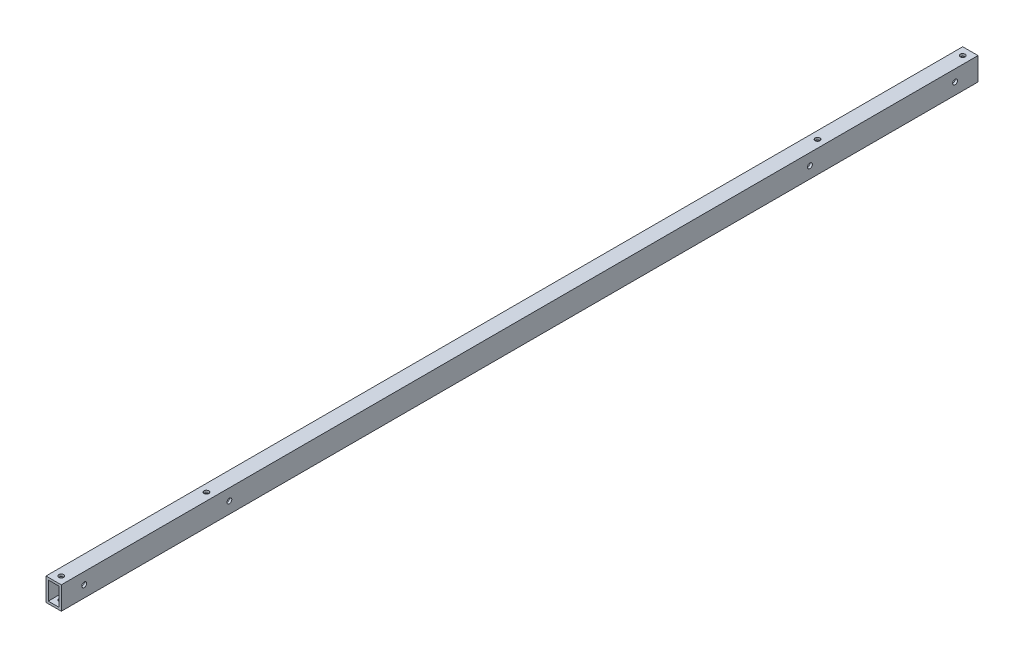
ISO-10303-21;
HEADER;
FILE_DESCRIPTION(('STEP AP214'),'2;1');
FILE_NAME('part.step','',(''),(''),'','','');
FILE_SCHEMA(('AUTOMOTIVE_DESIGN { 1 0 10303 214 1 1 1 1 }'));
ENDSEC;
DATA;
#1=APPLICATION_CONTEXT('core data for automotive mechanical design processes');
#2=APPLICATION_PROTOCOL_DEFINITION('international standard','automotive_design',2000,#1);
#3=PRODUCT_CONTEXT('',#1,'mechanical');
#4=PRODUCT('Part','Part','',(#3));
#5=PRODUCT_RELATED_PRODUCT_CATEGORY('part','',(#4));
#6=PRODUCT_DEFINITION_FORMATION('','',#4);
#7=PRODUCT_DEFINITION_CONTEXT('part definition',#1,'design');
#8=PRODUCT_DEFINITION('design','',#6,#7);
#9=PRODUCT_DEFINITION_SHAPE('','',#8);
#10=(LENGTH_UNIT() NAMED_UNIT(*) SI_UNIT(.MILLI.,.METRE.));
#11=(NAMED_UNIT(*) PLANE_ANGLE_UNIT() SI_UNIT($,.RADIAN.));
#12=(NAMED_UNIT(*) SI_UNIT($,.STERADIAN.) SOLID_ANGLE_UNIT());
#13=UNCERTAINTY_MEASURE_WITH_UNIT(LENGTH_MEASURE(1.E-05),#10,'distance_accuracy_value','');
#14=(GEOMETRIC_REPRESENTATION_CONTEXT(3) GLOBAL_UNCERTAINTY_ASSIGNED_CONTEXT((#13)) GLOBAL_UNIT_ASSIGNED_CONTEXT((#10,
#11,#12)) REPRESENTATION_CONTEXT('',''));
#15=CARTESIAN_POINT('',(0.,0.,0.));
#16=DIRECTION('',(0.,0.,1.));
#17=DIRECTION('',(1.,0.,0.));
#18=AXIS2_PLACEMENT_3D('',#15,#16,#17);
#19=CARTESIAN_POINT('',(0.,0.,600.));
#20=DIRECTION('',(0.,0.,1.));
#21=DIRECTION('',(1.,0.,0.));
#22=AXIS2_PLACEMENT_3D('',#19,#20,#21);
#23=PLANE('',#22);
#24=DIRECTION('',(0.,1.,0.));
#25=VECTOR('',#24,1.);
#26=CARTESIAN_POINT('',(5.,-7.5,600.));
#27=LINE('',#26,#25);
#28=CARTESIAN_POINT('',(5.,-7.5,600.));
#29=VERTEX_POINT('',#28);
#30=CARTESIAN_POINT('',(5.,7.5,600.));
#31=VERTEX_POINT('',#30);
#32=EDGE_CURVE('E162',#29,#31,#27,.T.);
#33=ORIENTED_EDGE('',*,*,#32,.T.);
#34=DIRECTION('',(-1.,0.,0.));
#35=VECTOR('',#34,1.);
#36=CARTESIAN_POINT('',(-5.,7.5,600.));
#37=LINE('',#36,#35);
#38=CARTESIAN_POINT('',(-5.,7.5,600.));
#39=VERTEX_POINT('',#38);
#40=EDGE_CURVE('E165',#31,#39,#37,.T.);
#41=ORIENTED_EDGE('',*,*,#40,.T.);
#42=DIRECTION('',(0.,-1.,0.));
#43=VECTOR('',#42,1.);
#44=CARTESIAN_POINT('',(-5.,-7.5,600.));
#45=LINE('',#44,#43);
#46=CARTESIAN_POINT('',(-5.,-7.5,600.));
#47=VERTEX_POINT('',#46);
#48=EDGE_CURVE('E168',#39,#47,#45,.T.);
#49=ORIENTED_EDGE('',*,*,#48,.T.);
#50=DIRECTION('',(1.,0.,0.));
#51=VECTOR('',#50,1.);
#52=CARTESIAN_POINT('',(-5.,-7.5,600.));
#53=LINE('',#52,#51);
#54=EDGE_CURVE('E170',#47,#29,#53,.T.);
#55=ORIENTED_EDGE('',*,*,#54,.T.);
#56=EDGE_LOOP('',(#33,#41,#49,#55));
#57=FACE_BOUND('',#56,.T.);
#58=DIRECTION('',(-1.,0.,0.));
#59=VECTOR('',#58,1.);
#60=CARTESIAN_POINT('',(0.,6.,600.));
#61=LINE('',#60,#59);
#62=CARTESIAN_POINT('',(3.5,6.,600.));
#63=VERTEX_POINT('',#62);
#64=CARTESIAN_POINT('',(-3.5,6.,600.));
#65=VERTEX_POINT('',#64);
#66=EDGE_CURVE('E132',#63,#65,#61,.T.);
#67=ORIENTED_EDGE('',*,*,#66,.F.);
#68=DIRECTION('',(0.,1.,0.));
#69=VECTOR('',#68,1.);
#70=CARTESIAN_POINT('',(3.5,0.,600.));
#71=LINE('',#70,#69);
#72=CARTESIAN_POINT('',(3.5,-6.,600.));
#73=VERTEX_POINT('',#72);
#74=EDGE_CURVE('E124',#73,#63,#71,.T.);
#75=ORIENTED_EDGE('',*,*,#74,.F.);
#76=DIRECTION('',(1.,0.,0.));
#77=VECTOR('',#76,1.);
#78=CARTESIAN_POINT('',(0.,-6.,600.));
#79=LINE('',#78,#77);
#80=CARTESIAN_POINT('',(-3.5,-6.,600.));
#81=VERTEX_POINT('',#80);
#82=EDGE_CURVE('E146',#81,#73,#79,.T.);
#83=ORIENTED_EDGE('',*,*,#82,.F.);
#84=DIRECTION('',(0.,-1.,0.));
#85=VECTOR('',#84,1.);
#86=CARTESIAN_POINT('',(-3.5,0.,600.));
#87=LINE('',#86,#85);
#88=EDGE_CURVE('E144',#65,#81,#87,.T.);
#89=ORIENTED_EDGE('',*,*,#88,.F.);
#90=EDGE_LOOP('',(#67,#75,#83,#89));
#91=FACE_BOUND('',#90,.T.);
#92=ADVANCED_FACE('F57',(#57,#91),#23,.T.);
#93=CARTESIAN_POINT('',(0.,0.,0.));
#94=DIRECTION('',(0.,0.,1.));
#95=DIRECTION('',(1.,0.,0.));
#96=AXIS2_PLACEMENT_3D('',#93,#94,#95);
#97=PLANE('',#96);
#98=DIRECTION('',(0.,1.,0.));
#99=VECTOR('',#98,1.);
#100=CARTESIAN_POINT('',(5.,-7.5,0.));
#101=LINE('',#100,#99);
#102=CARTESIAN_POINT('',(5.,-7.5,0.));
#103=VERTEX_POINT('',#102);
#104=CARTESIAN_POINT('',(5.,7.5,0.));
#105=VERTEX_POINT('',#104);
#106=EDGE_CURVE('E140',#103,#105,#101,.T.);
#107=ORIENTED_EDGE('',*,*,#106,.F.);
#108=DIRECTION('',(1.,0.,0.));
#109=VECTOR('',#108,1.);
#110=CARTESIAN_POINT('',(-5.,-7.5,0.));
#111=LINE('',#110,#109);
#112=CARTESIAN_POINT('',(-5.,-7.5,0.));
#113=VERTEX_POINT('',#112);
#114=EDGE_CURVE('E166',#113,#103,#111,.T.);
#115=ORIENTED_EDGE('',*,*,#114,.F.);
#116=DIRECTION('',(0.,-1.,0.));
#117=VECTOR('',#116,1.);
#118=CARTESIAN_POINT('',(-5.,-7.5,0.));
#119=LINE('',#118,#117);
#120=CARTESIAN_POINT('',(-5.,7.5,0.));
#121=VERTEX_POINT('',#120);
#122=EDGE_CURVE('E177',#121,#113,#119,.T.);
#123=ORIENTED_EDGE('',*,*,#122,.F.);
#124=DIRECTION('',(-1.,0.,0.));
#125=VECTOR('',#124,1.);
#126=CARTESIAN_POINT('',(-5.,7.5,0.));
#127=LINE('',#126,#125);
#128=EDGE_CURVE('E175',#105,#121,#127,.T.);
#129=ORIENTED_EDGE('',*,*,#128,.F.);
#130=EDGE_LOOP('',(#107,#115,#123,#129));
#131=FACE_BOUND('',#130,.T.);
#132=DIRECTION('',(0.,1.,0.));
#133=VECTOR('',#132,1.);
#134=CARTESIAN_POINT('',(3.5,0.,0.));
#135=LINE('',#134,#133);
#136=CARTESIAN_POINT('',(3.5,-6.,0.));
#137=VERTEX_POINT('',#136);
#138=CARTESIAN_POINT('',(3.5,6.,0.));
#139=VERTEX_POINT('',#138);
#140=EDGE_CURVE('E82',#137,#139,#135,.T.);
#141=ORIENTED_EDGE('',*,*,#140,.T.);
#142=DIRECTION('',(-1.,0.,0.));
#143=VECTOR('',#142,1.);
#144=CARTESIAN_POINT('',(0.,6.,0.));
#145=LINE('',#144,#143);
#146=CARTESIAN_POINT('',(-3.5,6.,0.));
#147=VERTEX_POINT('',#146);
#148=EDGE_CURVE('E139',#139,#147,#145,.T.);
#149=ORIENTED_EDGE('',*,*,#148,.T.);
#150=DIRECTION('',(0.,-1.,0.));
#151=VECTOR('',#150,1.);
#152=CARTESIAN_POINT('',(-3.5,0.,0.));
#153=LINE('',#152,#151);
#154=CARTESIAN_POINT('',(-3.5,-6.,0.));
#155=VERTEX_POINT('',#154);
#156=EDGE_CURVE('E154',#147,#155,#153,.T.);
#157=ORIENTED_EDGE('',*,*,#156,.T.);
#158=DIRECTION('',(1.,0.,0.));
#159=VECTOR('',#158,1.);
#160=CARTESIAN_POINT('',(0.,-6.,0.));
#161=LINE('',#160,#159);
#162=EDGE_CURVE('E133',#155,#137,#161,.T.);
#163=ORIENTED_EDGE('',*,*,#162,.T.);
#164=EDGE_LOOP('',(#141,#149,#157,#163));
#165=FACE_BOUND('',#164,.T.);
#166=ADVANCED_FACE('F295',(#131,#165),#97,.F.);
#167=CARTESIAN_POINT('',(5.,-7.5,600.));
#168=DIRECTION('',(-1.,0.,0.));
#169=DIRECTION('',(0.,0.,1.));
#170=AXIS2_PLACEMENT_3D('',#167,#168,#169);
#171=PLANE('',#170);
#172=CARTESIAN_POINT('',(5.,0.,585.));
#173=DIRECTION('',(1.,0.,0.));
#174=DIRECTION('',(0.,0.,-1.));
#175=AXIS2_PLACEMENT_3D('',#172,#173,#174);
#176=CIRCLE('',#175,1.59999999999991);
#177=CARTESIAN_POINT('',(5.,0.,583.4));
#178=VERTEX_POINT('',#177);
#179=EDGE_CURVE('E334',#178,#178,#176,.T.);
#180=ORIENTED_EDGE('',*,*,#179,.F.);
#181=EDGE_LOOP('',(#180));
#182=FACE_BOUND('',#181,.T.);
#183=CARTESIAN_POINT('',(5.,0.,110.));
#184=DIRECTION('',(1.,0.,0.));
#185=DIRECTION('',(0.,0.,1.));
#186=AXIS2_PLACEMENT_3D('',#183,#184,#185);
#187=CIRCLE('',#186,1.60000000000002);
#188=CARTESIAN_POINT('',(5.,0.,111.6));
#189=VERTEX_POINT('',#188);
#190=EDGE_CURVE('E342',#189,#189,#187,.T.);
#191=ORIENTED_EDGE('',*,*,#190,.F.);
#192=EDGE_LOOP('',(#191));
#193=FACE_BOUND('',#192,.T.);
#194=CARTESIAN_POINT('',(5.,0.,490.));
#195=DIRECTION('',(1.,0.,0.));
#196=DIRECTION('',(0.,0.,-1.));
#197=AXIS2_PLACEMENT_3D('',#194,#195,#196);
#198=CIRCLE('',#197,1.60000000000002);
#199=CARTESIAN_POINT('',(5.,0.,488.4));
#200=VERTEX_POINT('',#199);
#201=EDGE_CURVE('E345',#200,#200,#198,.T.);
#202=ORIENTED_EDGE('',*,*,#201,.F.);
#203=EDGE_LOOP('',(#202));
#204=FACE_BOUND('',#203,.T.);
#205=CARTESIAN_POINT('',(5.,0.,15.));
#206=DIRECTION('',(1.,0.,0.));
#207=DIRECTION('',(0.,0.,1.));
#208=AXIS2_PLACEMENT_3D('',#205,#206,#207);
#209=CIRCLE('',#208,1.60000000000001);
#210=CARTESIAN_POINT('',(5.,0.,16.6));
#211=VERTEX_POINT('',#210);
#212=EDGE_CURVE('E335',#211,#211,#209,.T.);
#213=ORIENTED_EDGE('',*,*,#212,.F.);
#214=EDGE_LOOP('',(#213));
#215=FACE_BOUND('',#214,.T.);
#216=ORIENTED_EDGE('',*,*,#106,.T.);
#217=DIRECTION('',(0.,0.,-1.));
#218=VECTOR('',#217,1.);
#219=CARTESIAN_POINT('',(5.,7.5,600.));
#220=LINE('',#219,#218);
#221=EDGE_CURVE('E12',#31,#105,#220,.T.);
#222=ORIENTED_EDGE('',*,*,#221,.F.);
#223=ORIENTED_EDGE('',*,*,#32,.F.);
#224=DIRECTION('',(0.,0.,-1.));
#225=VECTOR('',#224,1.);
#226=CARTESIAN_POINT('',(5.,-7.5,600.));
#227=LINE('',#226,#225);
#228=EDGE_CURVE('E172',#29,#103,#227,.T.);
#229=ORIENTED_EDGE('',*,*,#228,.T.);
#230=EDGE_LOOP('',(#216,#222,#223,#229));
#231=FACE_BOUND('',#230,.T.);
#232=ADVANCED_FACE('F59',(#182,#193,#204,#215,#231),#171,.F.);
#233=CARTESIAN_POINT('',(-5.,7.5,600.));
#234=DIRECTION('',(0.,-1.,0.));
#235=DIRECTION('',(0.,0.,-1.));
#236=AXIS2_PLACEMENT_3D('',#233,#234,#235);
#237=PLANE('',#236);
#238=CARTESIAN_POINT('',(0.,7.5,595.));
#239=DIRECTION('',(0.,1.,0.));
#240=DIRECTION('',(0.,0.,1.));
#241=AXIS2_PLACEMENT_3D('',#238,#239,#240);
#242=CIRCLE('',#241,1.60000000000001);
#243=CARTESIAN_POINT('',(0.,7.5,596.6));
#244=VERTEX_POINT('',#243);
#245=EDGE_CURVE('E231',#244,#244,#242,.T.);
#246=ORIENTED_EDGE('',*,*,#245,.F.);
#247=EDGE_LOOP('',(#246));
#248=FACE_BOUND('',#247,.T.);
#249=CARTESIAN_POINT('',(0.,7.5,100.));
#250=DIRECTION('',(0.,1.,0.));
#251=DIRECTION('',(0.,0.,-1.));
#252=AXIS2_PLACEMENT_3D('',#249,#250,#251);
#253=CIRCLE('',#252,1.6);
#254=CARTESIAN_POINT('',(0.,7.5,98.4));
#255=VERTEX_POINT('',#254);
#256=EDGE_CURVE('E228',#255,#255,#253,.T.);
#257=ORIENTED_EDGE('',*,*,#256,.F.);
#258=EDGE_LOOP('',(#257));
#259=FACE_BOUND('',#258,.T.);
#260=CARTESIAN_POINT('',(0.,7.5,500.));
#261=DIRECTION('',(0.,1.,0.));
#262=DIRECTION('',(0.,0.,1.));
#263=AXIS2_PLACEMENT_3D('',#260,#261,#262);
#264=CIRCLE('',#263,1.59999999999999);
#265=CARTESIAN_POINT('',(0.,7.5,501.6));
#266=VERTEX_POINT('',#265);
#267=EDGE_CURVE('E238',#266,#266,#264,.T.);
#268=ORIENTED_EDGE('',*,*,#267,.F.);
#269=EDGE_LOOP('',(#268));
#270=FACE_BOUND('',#269,.T.);
#271=CARTESIAN_POINT('',(0.,7.5,5.));
#272=DIRECTION('',(0.,1.,0.));
#273=DIRECTION('',(0.,0.,-1.));
#274=AXIS2_PLACEMENT_3D('',#271,#272,#273);
#275=CIRCLE('',#274,1.6);
#276=CARTESIAN_POINT('',(0.,7.5,3.4));
#277=VERTEX_POINT('',#276);
#278=EDGE_CURVE('E243',#277,#277,#275,.T.);
#279=ORIENTED_EDGE('',*,*,#278,.F.);
#280=EDGE_LOOP('',(#279));
#281=FACE_BOUND('',#280,.T.);
#282=ORIENTED_EDGE('',*,*,#128,.T.);
#283=DIRECTION('',(0.,0.,-1.));
#284=VECTOR('',#283,1.);
#285=CARTESIAN_POINT('',(-5.,7.5,600.));
#286=LINE('',#285,#284);
#287=EDGE_CURVE('E66',#39,#121,#286,.T.);
#288=ORIENTED_EDGE('',*,*,#287,.F.);
#289=ORIENTED_EDGE('',*,*,#40,.F.);
#290=ORIENTED_EDGE('',*,*,#221,.T.);
#291=EDGE_LOOP('',(#282,#288,#289,#290));
#292=FACE_BOUND('',#291,.T.);
#293=ADVANCED_FACE('F281',(#248,#259,#270,#281,#292),#237,.F.);
#294=CARTESIAN_POINT('',(-5.,-7.5,600.));
#295=DIRECTION('',(1.,0.,0.));
#296=DIRECTION('',(0.,0.,-1.));
#297=AXIS2_PLACEMENT_3D('',#294,#295,#296);
#298=PLANE('',#297);
#299=CARTESIAN_POINT('',(-5.,0.,585.));
#300=DIRECTION('',(1.,0.,0.));
#301=DIRECTION('',(0.,0.,-1.));
#302=AXIS2_PLACEMENT_3D('',#299,#300,#301);
#303=CIRCLE('',#302,1.59999999999991);
#304=CARTESIAN_POINT('',(-5.,0.,583.4));
#305=VERTEX_POINT('',#304);
#306=EDGE_CURVE('E207',#305,#305,#303,.T.);
#307=ORIENTED_EDGE('',*,*,#306,.T.);
#308=EDGE_LOOP('',(#307));
#309=FACE_BOUND('',#308,.T.);
#310=CARTESIAN_POINT('',(-5.,0.,110.));
#311=DIRECTION('',(1.,0.,0.));
#312=DIRECTION('',(0.,0.,1.));
#313=AXIS2_PLACEMENT_3D('',#310,#311,#312);
#314=CIRCLE('',#313,1.60000000000002);
#315=CARTESIAN_POINT('',(-5.,0.,111.6));
#316=VERTEX_POINT('',#315);
#317=EDGE_CURVE('E325',#316,#316,#314,.T.);
#318=ORIENTED_EDGE('',*,*,#317,.T.);
#319=EDGE_LOOP('',(#318));
#320=FACE_BOUND('',#319,.T.);
#321=CARTESIAN_POINT('',(-5.,0.,490.));
#322=DIRECTION('',(1.,0.,0.));
#323=DIRECTION('',(0.,0.,-1.));
#324=AXIS2_PLACEMENT_3D('',#321,#322,#323);
#325=CIRCLE('',#324,1.60000000000002);
#326=CARTESIAN_POINT('',(-5.,0.,488.4));
#327=VERTEX_POINT('',#326);
#328=EDGE_CURVE('E329',#327,#327,#325,.T.);
#329=ORIENTED_EDGE('',*,*,#328,.T.);
#330=EDGE_LOOP('',(#329));
#331=FACE_BOUND('',#330,.T.);
#332=CARTESIAN_POINT('',(-5.,0.,15.));
#333=DIRECTION('',(1.,0.,0.));
#334=DIRECTION('',(0.,0.,1.));
#335=AXIS2_PLACEMENT_3D('',#332,#333,#334);
#336=CIRCLE('',#335,1.60000000000001);
#337=CARTESIAN_POINT('',(-5.,0.,16.6));
#338=VERTEX_POINT('',#337);
#339=EDGE_CURVE('E332',#338,#338,#336,.T.);
#340=ORIENTED_EDGE('',*,*,#339,.T.);
#341=EDGE_LOOP('',(#340));
#342=FACE_BOUND('',#341,.T.);
#343=ORIENTED_EDGE('',*,*,#122,.T.);
#344=DIRECTION('',(0.,0.,-1.));
#345=VECTOR('',#344,1.);
#346=CARTESIAN_POINT('',(-5.,-7.5,600.));
#347=LINE('',#346,#345);
#348=EDGE_CURVE('E182',#47,#113,#347,.T.);
#349=ORIENTED_EDGE('',*,*,#348,.F.);
#350=ORIENTED_EDGE('',*,*,#48,.F.);
#351=ORIENTED_EDGE('',*,*,#287,.T.);
#352=EDGE_LOOP('',(#343,#349,#350,#351));
#353=FACE_BOUND('',#352,.T.);
#354=ADVANCED_FACE('F284',(#309,#320,#331,#342,#353),#298,.F.);
#355=CARTESIAN_POINT('',(-5.,-7.5,600.));
#356=DIRECTION('',(0.,1.,0.));
#357=DIRECTION('',(0.,0.,1.));
#358=AXIS2_PLACEMENT_3D('',#355,#356,#357);
#359=PLANE('',#358);
#360=CARTESIAN_POINT('',(0.,-7.5,595.));
#361=DIRECTION('',(0.,1.,0.));
#362=DIRECTION('',(0.,0.,1.));
#363=AXIS2_PLACEMENT_3D('',#360,#361,#362);
#364=CIRCLE('',#363,1.60000000000001);
#365=CARTESIAN_POINT('',(0.,-7.5,596.6));
#366=VERTEX_POINT('',#365);
#367=EDGE_CURVE('E191',#366,#366,#364,.T.);
#368=ORIENTED_EDGE('',*,*,#367,.T.);
#369=EDGE_LOOP('',(#368));
#370=FACE_BOUND('',#369,.T.);
#371=CARTESIAN_POINT('',(0.,-7.5,100.));
#372=DIRECTION('',(0.,1.,0.));
#373=DIRECTION('',(0.,0.,-1.));
#374=AXIS2_PLACEMENT_3D('',#371,#372,#373);
#375=CIRCLE('',#374,1.6);
#376=CARTESIAN_POINT('',(0.,-7.5,98.4));
#377=VERTEX_POINT('',#376);
#378=EDGE_CURVE('E235',#377,#377,#375,.T.);
#379=ORIENTED_EDGE('',*,*,#378,.T.);
#380=EDGE_LOOP('',(#379));
#381=FACE_BOUND('',#380,.T.);
#382=CARTESIAN_POINT('',(0.,-7.5,500.));
#383=DIRECTION('',(0.,1.,0.));
#384=DIRECTION('',(0.,0.,1.));
#385=AXIS2_PLACEMENT_3D('',#382,#383,#384);
#386=CIRCLE('',#385,1.59999999999999);
#387=CARTESIAN_POINT('',(0.,-7.5,501.6));
#388=VERTEX_POINT('',#387);
#389=EDGE_CURVE('E246',#388,#388,#386,.T.);
#390=ORIENTED_EDGE('',*,*,#389,.T.);
#391=EDGE_LOOP('',(#390));
#392=FACE_BOUND('',#391,.T.);
#393=CARTESIAN_POINT('',(0.,-7.5,5.));
#394=DIRECTION('',(0.,1.,0.));
#395=DIRECTION('',(0.,0.,-1.));
#396=AXIS2_PLACEMENT_3D('',#393,#394,#395);
#397=CIRCLE('',#396,1.6);
#398=CARTESIAN_POINT('',(0.,-7.5,3.4));
#399=VERTEX_POINT('',#398);
#400=EDGE_CURVE('E234',#399,#399,#397,.T.);
#401=ORIENTED_EDGE('',*,*,#400,.T.);
#402=EDGE_LOOP('',(#401));
#403=FACE_BOUND('',#402,.T.);
#404=ORIENTED_EDGE('',*,*,#114,.T.);
#405=ORIENTED_EDGE('',*,*,#228,.F.);
#406=ORIENTED_EDGE('',*,*,#54,.F.);
#407=ORIENTED_EDGE('',*,*,#348,.T.);
#408=EDGE_LOOP('',(#404,#405,#406,#407));
#409=FACE_BOUND('',#408,.T.);
#410=ADVANCED_FACE('F299',(#370,#381,#392,#403,#409),#359,.F.);
#411=CARTESIAN_POINT('',(3.5,0.,600.));
#412=DIRECTION('',(-1.,0.,0.));
#413=DIRECTION('',(0.,0.,1.));
#414=AXIS2_PLACEMENT_3D('',#411,#412,#413);
#415=PLANE('',#414);
#416=CARTESIAN_POINT('',(3.5,0.,585.));
#417=DIRECTION('',(-1.,0.,0.));
#418=DIRECTION('',(0.,0.,1.));
#419=AXIS2_PLACEMENT_3D('',#416,#417,#418);
#420=CIRCLE('',#419,1.59999999999991);
#421=CARTESIAN_POINT('',(3.5,0.,586.6));
#422=VERTEX_POINT('',#421);
#423=EDGE_CURVE('E225',#422,#422,#420,.T.);
#424=ORIENTED_EDGE('',*,*,#423,.F.);
#425=EDGE_LOOP('',(#424));
#426=FACE_BOUND('',#425,.T.);
#427=CARTESIAN_POINT('',(3.5,0.,110.));
#428=DIRECTION('',(-1.,0.,0.));
#429=DIRECTION('',(0.,0.,1.));
#430=AXIS2_PLACEMENT_3D('',#427,#428,#429);
#431=CIRCLE('',#430,1.60000000000002);
#432=CARTESIAN_POINT('',(3.5,0.,111.6));
#433=VERTEX_POINT('',#432);
#434=EDGE_CURVE('E213',#433,#433,#431,.T.);
#435=ORIENTED_EDGE('',*,*,#434,.F.);
#436=EDGE_LOOP('',(#435));
#437=FACE_BOUND('',#436,.T.);
#438=CARTESIAN_POINT('',(3.5,0.,490.));
#439=DIRECTION('',(-1.,0.,0.));
#440=DIRECTION('',(0.,0.,1.));
#441=AXIS2_PLACEMENT_3D('',#438,#439,#440);
#442=CIRCLE('',#441,1.60000000000002);
#443=CARTESIAN_POINT('',(3.5,0.,491.6));
#444=VERTEX_POINT('',#443);
#445=EDGE_CURVE('E210',#444,#444,#442,.T.);
#446=ORIENTED_EDGE('',*,*,#445,.F.);
#447=EDGE_LOOP('',(#446));
#448=FACE_BOUND('',#447,.T.);
#449=CARTESIAN_POINT('',(3.5,0.,15.));
#450=DIRECTION('',(-1.,0.,0.));
#451=DIRECTION('',(0.,0.,1.));
#452=AXIS2_PLACEMENT_3D('',#449,#450,#451);
#453=CIRCLE('',#452,1.60000000000001);
#454=CARTESIAN_POINT('',(3.5,0.,16.6));
#455=VERTEX_POINT('',#454);
#456=EDGE_CURVE('E206',#455,#455,#453,.T.);
#457=ORIENTED_EDGE('',*,*,#456,.F.);
#458=EDGE_LOOP('',(#457));
#459=FACE_BOUND('',#458,.T.);
#460=ORIENTED_EDGE('',*,*,#140,.F.);
#461=DIRECTION('',(0.,0.,-1.));
#462=VECTOR('',#461,1.);
#463=CARTESIAN_POINT('',(3.5,-6.,600.));
#464=LINE('',#463,#462);
#465=EDGE_CURVE('E128',#73,#137,#464,.T.);
#466=ORIENTED_EDGE('',*,*,#465,.F.);
#467=ORIENTED_EDGE('',*,*,#74,.T.);
#468=DIRECTION('',(0.,0.,-1.));
#469=VECTOR('',#468,1.);
#470=CARTESIAN_POINT('',(3.5,6.,600.));
#471=LINE('',#470,#469);
#472=EDGE_CURVE('E127',#63,#139,#471,.T.);
#473=ORIENTED_EDGE('',*,*,#472,.T.);
#474=EDGE_LOOP('',(#460,#466,#467,#473));
#475=FACE_BOUND('',#474,.T.);
#476=ADVANCED_FACE('F126',(#426,#437,#448,#459,#475),#415,.T.);
#477=CARTESIAN_POINT('',(0.,6.,600.));
#478=DIRECTION('',(0.,-1.,0.));
#479=DIRECTION('',(0.,0.,-1.));
#480=AXIS2_PLACEMENT_3D('',#477,#478,#479);
#481=PLANE('',#480);
#482=CARTESIAN_POINT('',(0.,6.,595.));
#483=DIRECTION('',(0.,-1.,0.));
#484=DIRECTION('',(0.,0.,-1.));
#485=AXIS2_PLACEMENT_3D('',#482,#483,#484);
#486=CIRCLE('',#485,1.60000000000001);
#487=CARTESIAN_POINT('',(0.,6.,593.4));
#488=VERTEX_POINT('',#487);
#489=EDGE_CURVE('E152',#488,#488,#486,.T.);
#490=ORIENTED_EDGE('',*,*,#489,.F.);
#491=EDGE_LOOP('',(#490));
#492=FACE_BOUND('',#491,.T.);
#493=CARTESIAN_POINT('',(0.,6.,100.));
#494=DIRECTION('',(0.,-1.,0.));
#495=DIRECTION('',(0.,0.,-1.));
#496=AXIS2_PLACEMENT_3D('',#493,#494,#495);
#497=CIRCLE('',#496,1.6);
#498=CARTESIAN_POINT('',(0.,6.,98.4));
#499=VERTEX_POINT('',#498);
#500=EDGE_CURVE('E199',#499,#499,#497,.T.);
#501=ORIENTED_EDGE('',*,*,#500,.F.);
#502=EDGE_LOOP('',(#501));
#503=FACE_BOUND('',#502,.T.);
#504=CARTESIAN_POINT('',(0.,6.,500.));
#505=DIRECTION('',(0.,-1.,0.));
#506=DIRECTION('',(0.,0.,-1.));
#507=AXIS2_PLACEMENT_3D('',#504,#505,#506);
#508=CIRCLE('',#507,1.59999999999999);
#509=CARTESIAN_POINT('',(0.,6.,498.4));
#510=VERTEX_POINT('',#509);
#511=EDGE_CURVE('E195',#510,#510,#508,.T.);
#512=ORIENTED_EDGE('',*,*,#511,.F.);
#513=EDGE_LOOP('',(#512));
#514=FACE_BOUND('',#513,.T.);
#515=CARTESIAN_POINT('',(0.,6.,5.));
#516=DIRECTION('',(0.,-1.,0.));
#517=DIRECTION('',(0.,0.,-1.));
#518=AXIS2_PLACEMENT_3D('',#515,#516,#517);
#519=CIRCLE('',#518,1.6);
#520=CARTESIAN_POINT('',(0.,6.,3.4));
#521=VERTEX_POINT('',#520);
#522=EDGE_CURVE('E190',#521,#521,#519,.T.);
#523=ORIENTED_EDGE('',*,*,#522,.F.);
#524=EDGE_LOOP('',(#523));
#525=FACE_BOUND('',#524,.T.);
#526=ORIENTED_EDGE('',*,*,#148,.F.);
#527=ORIENTED_EDGE('',*,*,#472,.F.);
#528=ORIENTED_EDGE('',*,*,#66,.T.);
#529=DIRECTION('',(0.,0.,-1.));
#530=VECTOR('',#529,1.);
#531=CARTESIAN_POINT('',(-3.5,6.,600.));
#532=LINE('',#531,#530);
#533=EDGE_CURVE('E141',#65,#147,#532,.T.);
#534=ORIENTED_EDGE('',*,*,#533,.T.);
#535=EDGE_LOOP('',(#526,#527,#528,#534));
#536=FACE_BOUND('',#535,.T.);
#537=ADVANCED_FACE('F136',(#492,#503,#514,#525,#536),#481,.T.);
#538=CARTESIAN_POINT('',(-3.5,0.,600.));
#539=DIRECTION('',(1.,0.,0.));
#540=DIRECTION('',(0.,0.,-1.));
#541=AXIS2_PLACEMENT_3D('',#538,#539,#540);
#542=PLANE('',#541);
#543=CARTESIAN_POINT('',(-3.5,0.,585.));
#544=DIRECTION('',(1.,0.,0.));
#545=DIRECTION('',(0.,0.,-1.));
#546=AXIS2_PLACEMENT_3D('',#543,#544,#545);
#547=CIRCLE('',#546,1.59999999999991);
#548=CARTESIAN_POINT('',(-3.5,0.,583.4));
#549=VERTEX_POINT('',#548);
#550=EDGE_CURVE('E61',#549,#549,#547,.T.);
#551=ORIENTED_EDGE('',*,*,#550,.F.);
#552=EDGE_LOOP('',(#551));
#553=FACE_BOUND('',#552,.T.);
#554=CARTESIAN_POINT('',(-3.5,0.,110.));
#555=DIRECTION('',(1.,0.,0.));
#556=DIRECTION('',(0.,0.,-1.));
#557=AXIS2_PLACEMENT_3D('',#554,#555,#556);
#558=CIRCLE('',#557,1.60000000000002);
#559=CARTESIAN_POINT('',(-3.5,0.,108.4));
#560=VERTEX_POINT('',#559);
#561=EDGE_CURVE('E211',#560,#560,#558,.T.);
#562=ORIENTED_EDGE('',*,*,#561,.F.);
#563=EDGE_LOOP('',(#562));
#564=FACE_BOUND('',#563,.T.);
#565=CARTESIAN_POINT('',(-3.5,0.,490.));
#566=DIRECTION('',(1.,0.,0.));
#567=DIRECTION('',(0.,0.,-1.));
#568=AXIS2_PLACEMENT_3D('',#565,#566,#567);
#569=CIRCLE('',#568,1.60000000000002);
#570=CARTESIAN_POINT('',(-3.5,0.,488.4));
#571=VERTEX_POINT('',#570);
#572=EDGE_CURVE('E208',#571,#571,#569,.T.);
#573=ORIENTED_EDGE('',*,*,#572,.F.);
#574=EDGE_LOOP('',(#573));
#575=FACE_BOUND('',#574,.T.);
#576=CARTESIAN_POINT('',(-3.5,0.,15.));
#577=DIRECTION('',(1.,0.,0.));
#578=DIRECTION('',(0.,0.,-1.));
#579=AXIS2_PLACEMENT_3D('',#576,#577,#578);
#580=CIRCLE('',#579,1.60000000000001);
#581=CARTESIAN_POINT('',(-3.5,0.,13.4));
#582=VERTEX_POINT('',#581);
#583=EDGE_CURVE('E203',#582,#582,#580,.T.);
#584=ORIENTED_EDGE('',*,*,#583,.F.);
#585=EDGE_LOOP('',(#584));
#586=FACE_BOUND('',#585,.T.);
#587=ORIENTED_EDGE('',*,*,#156,.F.);
#588=ORIENTED_EDGE('',*,*,#533,.F.);
#589=ORIENTED_EDGE('',*,*,#88,.T.);
#590=DIRECTION('',(0.,0.,-1.));
#591=VECTOR('',#590,1.);
#592=CARTESIAN_POINT('',(-3.5,-6.,600.));
#593=LINE('',#592,#591);
#594=EDGE_CURVE('E74',#81,#155,#593,.T.);
#595=ORIENTED_EDGE('',*,*,#594,.T.);
#596=EDGE_LOOP('',(#587,#588,#589,#595));
#597=FACE_BOUND('',#596,.T.);
#598=ADVANCED_FACE('F264',(#553,#564,#575,#586,#597),#542,.T.);
#599=CARTESIAN_POINT('',(0.,-6.,600.));
#600=DIRECTION('',(0.,1.,0.));
#601=DIRECTION('',(0.,0.,1.));
#602=AXIS2_PLACEMENT_3D('',#599,#600,#601);
#603=PLANE('',#602);
#604=CARTESIAN_POINT('',(0.,-6.,595.));
#605=DIRECTION('',(0.,1.,0.));
#606=DIRECTION('',(0.,0.,1.));
#607=AXIS2_PLACEMENT_3D('',#604,#605,#606);
#608=CIRCLE('',#607,1.60000000000001);
#609=CARTESIAN_POINT('',(0.,-6.,596.6));
#610=VERTEX_POINT('',#609);
#611=EDGE_CURVE('E200',#610,#610,#608,.T.);
#612=ORIENTED_EDGE('',*,*,#611,.F.);
#613=EDGE_LOOP('',(#612));
#614=FACE_BOUND('',#613,.T.);
#615=CARTESIAN_POINT('',(0.,-6.,100.));
#616=DIRECTION('',(0.,1.,0.));
#617=DIRECTION('',(0.,0.,1.));
#618=AXIS2_PLACEMENT_3D('',#615,#616,#617);
#619=CIRCLE('',#618,1.6);
#620=CARTESIAN_POINT('',(0.,-6.,101.6));
#621=VERTEX_POINT('',#620);
#622=EDGE_CURVE('E196',#621,#621,#619,.T.);
#623=ORIENTED_EDGE('',*,*,#622,.F.);
#624=EDGE_LOOP('',(#623));
#625=FACE_BOUND('',#624,.T.);
#626=CARTESIAN_POINT('',(0.,-6.,500.));
#627=DIRECTION('',(0.,1.,0.));
#628=DIRECTION('',(0.,0.,1.));
#629=AXIS2_PLACEMENT_3D('',#626,#627,#628);
#630=CIRCLE('',#629,1.59999999999999);
#631=CARTESIAN_POINT('',(0.,-6.,501.6));
#632=VERTEX_POINT('',#631);
#633=EDGE_CURVE('E192',#632,#632,#630,.T.);
#634=ORIENTED_EDGE('',*,*,#633,.F.);
#635=EDGE_LOOP('',(#634));
#636=FACE_BOUND('',#635,.T.);
#637=CARTESIAN_POINT('',(0.,-6.,5.));
#638=DIRECTION('',(0.,1.,0.));
#639=DIRECTION('',(0.,0.,1.));
#640=AXIS2_PLACEMENT_3D('',#637,#638,#639);
#641=CIRCLE('',#640,1.6);
#642=CARTESIAN_POINT('',(0.,-6.,6.60000000000001));
#643=VERTEX_POINT('',#642);
#644=EDGE_CURVE('E187',#643,#643,#641,.T.);
#645=ORIENTED_EDGE('',*,*,#644,.F.);
#646=EDGE_LOOP('',(#645));
#647=FACE_BOUND('',#646,.T.);
#648=ORIENTED_EDGE('',*,*,#162,.F.);
#649=ORIENTED_EDGE('',*,*,#594,.F.);
#650=ORIENTED_EDGE('',*,*,#82,.T.);
#651=ORIENTED_EDGE('',*,*,#465,.T.);
#652=EDGE_LOOP('',(#648,#649,#650,#651));
#653=FACE_BOUND('',#652,.T.);
#654=ADVANCED_FACE('F393',(#614,#625,#636,#647,#653),#603,.T.);
#655=CARTESIAN_POINT('',(0.,-7.5,5.));
#656=DIRECTION('',(0.,1.,0.));
#657=DIRECTION('',(0.,0.,1.));
#658=AXIS2_PLACEMENT_3D('',#655,#656,#657);
#659=CYLINDRICAL_SURFACE('',#658,1.6);
#660=ORIENTED_EDGE('',*,*,#644,.T.);
#661=EDGE_LOOP('',(#660));
#662=FACE_BOUND('',#661,.T.);
#663=ORIENTED_EDGE('',*,*,#400,.F.);
#664=EDGE_LOOP('',(#663));
#665=FACE_BOUND('',#664,.T.);
#666=ADVANCED_FACE('F278',(#662,#665),#659,.F.);
#667=CARTESIAN_POINT('',(0.,-7.5,500.));
#668=DIRECTION('',(0.,1.,0.));
#669=DIRECTION('',(0.,0.,1.));
#670=AXIS2_PLACEMENT_3D('',#667,#668,#669);
#671=CYLINDRICAL_SURFACE('',#670,1.59999999999999);
#672=ORIENTED_EDGE('',*,*,#633,.T.);
#673=EDGE_LOOP('',(#672));
#674=FACE_BOUND('',#673,.T.);
#675=ORIENTED_EDGE('',*,*,#389,.F.);
#676=EDGE_LOOP('',(#675));
#677=FACE_BOUND('',#676,.T.);
#678=ADVANCED_FACE('F403',(#674,#677),#671,.F.);
#679=CARTESIAN_POINT('',(0.,-7.5,100.));
#680=DIRECTION('',(0.,1.,0.));
#681=DIRECTION('',(0.,0.,1.));
#682=AXIS2_PLACEMENT_3D('',#679,#680,#681);
#683=CYLINDRICAL_SURFACE('',#682,1.6);
#684=ORIENTED_EDGE('',*,*,#622,.T.);
#685=EDGE_LOOP('',(#684));
#686=FACE_BOUND('',#685,.T.);
#687=ORIENTED_EDGE('',*,*,#378,.F.);
#688=EDGE_LOOP('',(#687));
#689=FACE_BOUND('',#688,.T.);
#690=ADVANCED_FACE('F409',(#686,#689),#683,.F.);
#691=CARTESIAN_POINT('',(0.,-7.5,595.));
#692=DIRECTION('',(0.,1.,0.));
#693=DIRECTION('',(0.,0.,1.));
#694=AXIS2_PLACEMENT_3D('',#691,#692,#693);
#695=CYLINDRICAL_SURFACE('',#694,1.60000000000001);
#696=ORIENTED_EDGE('',*,*,#611,.T.);
#697=EDGE_LOOP('',(#696));
#698=FACE_BOUND('',#697,.T.);
#699=ORIENTED_EDGE('',*,*,#367,.F.);
#700=EDGE_LOOP('',(#699));
#701=FACE_BOUND('',#700,.T.);
#702=ADVANCED_FACE('F276',(#698,#701),#695,.F.);
#703=ORIENTED_EDGE('',*,*,#522,.T.);
#704=EDGE_LOOP('',(#703));
#705=FACE_BOUND('',#704,.T.);
#706=ORIENTED_EDGE('',*,*,#278,.T.);
#707=EDGE_LOOP('',(#706));
#708=FACE_BOUND('',#707,.T.);
#709=ADVANCED_FACE('F272',(#705,#708),#659,.F.);
#710=ORIENTED_EDGE('',*,*,#511,.T.);
#711=EDGE_LOOP('',(#710));
#712=FACE_BOUND('',#711,.T.);
#713=ORIENTED_EDGE('',*,*,#267,.T.);
#714=EDGE_LOOP('',(#713));
#715=FACE_BOUND('',#714,.T.);
#716=ADVANCED_FACE('F275',(#712,#715),#671,.F.);
#717=ORIENTED_EDGE('',*,*,#500,.T.);
#718=EDGE_LOOP('',(#717));
#719=FACE_BOUND('',#718,.T.);
#720=ORIENTED_EDGE('',*,*,#256,.T.);
#721=EDGE_LOOP('',(#720));
#722=FACE_BOUND('',#721,.T.);
#723=ADVANCED_FACE('F387',(#719,#722),#683,.F.);
#724=ORIENTED_EDGE('',*,*,#489,.T.);
#725=EDGE_LOOP('',(#724));
#726=FACE_BOUND('',#725,.T.);
#727=ORIENTED_EDGE('',*,*,#245,.T.);
#728=EDGE_LOOP('',(#727));
#729=FACE_BOUND('',#728,.T.);
#730=ADVANCED_FACE('F259',(#726,#729),#695,.F.);
#731=CARTESIAN_POINT('',(-5.,0.,15.));
#732=DIRECTION('',(1.,0.,0.));
#733=DIRECTION('',(0.,0.,-1.));
#734=AXIS2_PLACEMENT_3D('',#731,#732,#733);
#735=CYLINDRICAL_SURFACE('',#734,1.60000000000001);
#736=ORIENTED_EDGE('',*,*,#583,.T.);
#737=EDGE_LOOP('',(#736));
#738=FACE_BOUND('',#737,.T.);
#739=ORIENTED_EDGE('',*,*,#339,.F.);
#740=EDGE_LOOP('',(#739));
#741=FACE_BOUND('',#740,.T.);
#742=ADVANCED_FACE('F367',(#738,#741),#735,.F.);
#743=CARTESIAN_POINT('',(-5.,0.,490.));
#744=DIRECTION('',(1.,0.,0.));
#745=DIRECTION('',(0.,0.,-1.));
#746=AXIS2_PLACEMENT_3D('',#743,#744,#745);
#747=CYLINDRICAL_SURFACE('',#746,1.60000000000002);
#748=ORIENTED_EDGE('',*,*,#572,.T.);
#749=EDGE_LOOP('',(#748));
#750=FACE_BOUND('',#749,.T.);
#751=ORIENTED_EDGE('',*,*,#328,.F.);
#752=EDGE_LOOP('',(#751));
#753=FACE_BOUND('',#752,.T.);
#754=ADVANCED_FACE('F373',(#750,#753),#747,.F.);
#755=CARTESIAN_POINT('',(-5.,0.,110.));
#756=DIRECTION('',(1.,0.,0.));
#757=DIRECTION('',(0.,0.,-1.));
#758=AXIS2_PLACEMENT_3D('',#755,#756,#757);
#759=CYLINDRICAL_SURFACE('',#758,1.60000000000002);
#760=ORIENTED_EDGE('',*,*,#561,.T.);
#761=EDGE_LOOP('',(#760));
#762=FACE_BOUND('',#761,.T.);
#763=ORIENTED_EDGE('',*,*,#317,.F.);
#764=EDGE_LOOP('',(#763));
#765=FACE_BOUND('',#764,.T.);
#766=ADVANCED_FACE('F374',(#762,#765),#759,.F.);
#767=CARTESIAN_POINT('',(-5.,0.,585.));
#768=DIRECTION('',(1.,0.,0.));
#769=DIRECTION('',(0.,0.,-1.));
#770=AXIS2_PLACEMENT_3D('',#767,#768,#769);
#771=CYLINDRICAL_SURFACE('',#770,1.59999999999991);
#772=ORIENTED_EDGE('',*,*,#550,.T.);
#773=EDGE_LOOP('',(#772));
#774=FACE_BOUND('',#773,.T.);
#775=ORIENTED_EDGE('',*,*,#306,.F.);
#776=EDGE_LOOP('',(#775));
#777=FACE_BOUND('',#776,.T.);
#778=ADVANCED_FACE('F364',(#774,#777),#771,.F.);
#779=ORIENTED_EDGE('',*,*,#456,.T.);
#780=EDGE_LOOP('',(#779));
#781=FACE_BOUND('',#780,.T.);
#782=ORIENTED_EDGE('',*,*,#212,.T.);
#783=EDGE_LOOP('',(#782));
#784=FACE_BOUND('',#783,.T.);
#785=ADVANCED_FACE('F361',(#781,#784),#735,.F.);
#786=ORIENTED_EDGE('',*,*,#445,.T.);
#787=EDGE_LOOP('',(#786));
#788=FACE_BOUND('',#787,.T.);
#789=ORIENTED_EDGE('',*,*,#201,.T.);
#790=EDGE_LOOP('',(#789));
#791=FACE_BOUND('',#790,.T.);
#792=ADVANCED_FACE('F363',(#788,#791),#747,.F.);
#793=ORIENTED_EDGE('',*,*,#434,.T.);
#794=EDGE_LOOP('',(#793));
#795=FACE_BOUND('',#794,.T.);
#796=ORIENTED_EDGE('',*,*,#190,.T.);
#797=EDGE_LOOP('',(#796));
#798=FACE_BOUND('',#797,.T.);
#799=ADVANCED_FACE('F353',(#795,#798),#759,.F.);
#800=ORIENTED_EDGE('',*,*,#423,.T.);
#801=EDGE_LOOP('',(#800));
#802=FACE_BOUND('',#801,.T.);
#803=ORIENTED_EDGE('',*,*,#179,.T.);
#804=EDGE_LOOP('',(#803));
#805=FACE_BOUND('',#804,.T.);
#806=ADVANCED_FACE('F377',(#802,#805),#771,.F.);
#807=CLOSED_SHELL('',(#92,#166,#232,#293,#354,#410,#476,#537,#598,#654,#666,#678,#690,#702,#709,
#716,#723,#730,#742,#754,#766,#778,#785,#792,#799,#806));
#808=MANIFOLD_SOLID_BREP('B2',#807);
#809=ADVANCED_BREP_SHAPE_REPRESENTATION('',(#18,#808),#14);
#810=SHAPE_DEFINITION_REPRESENTATION(#9,#809);
ENDSEC;
END-ISO-10303-21;
